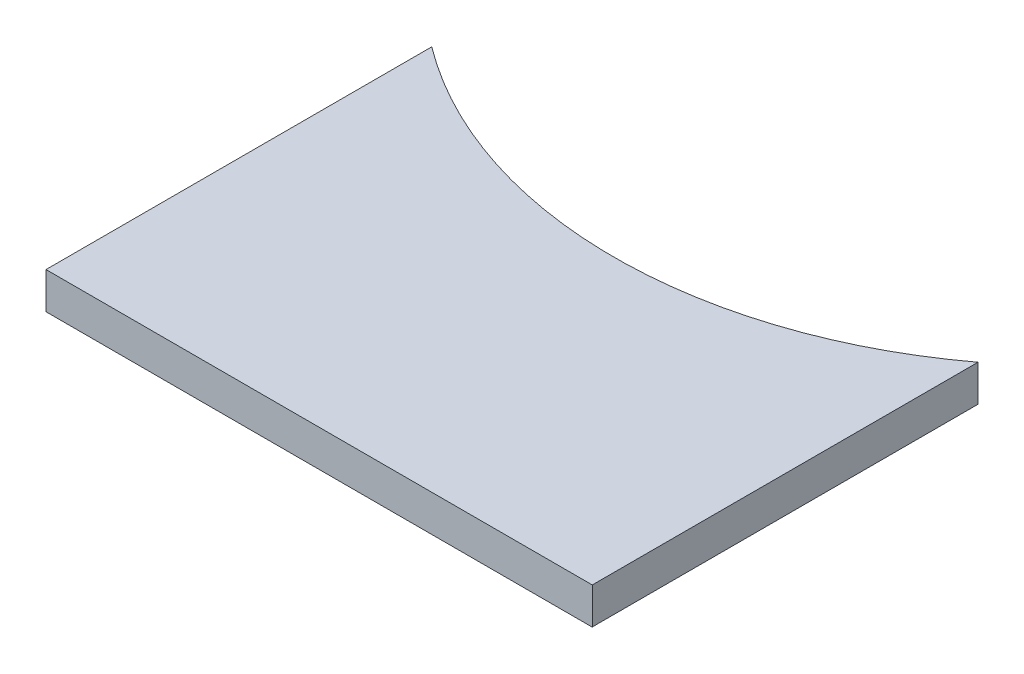
ISO-10303-21;
HEADER;
FILE_DESCRIPTION(('STEP AP214'),'2;1');
FILE_NAME('part.step','',(''),(''),'','','');
FILE_SCHEMA(('AUTOMOTIVE_DESIGN { 1 0 10303 214 1 1 1 1 }'));
ENDSEC;
DATA;
#1=APPLICATION_CONTEXT('core data for automotive mechanical design processes');
#2=APPLICATION_PROTOCOL_DEFINITION('international standard','automotive_design',2000,#1);
#3=PRODUCT_CONTEXT('',#1,'mechanical');
#4=PRODUCT('Part','Part','',(#3));
#5=PRODUCT_RELATED_PRODUCT_CATEGORY('part','',(#4));
#6=PRODUCT_DEFINITION_FORMATION('','',#4);
#7=PRODUCT_DEFINITION_CONTEXT('part definition',#1,'design');
#8=PRODUCT_DEFINITION('design','',#6,#7);
#9=PRODUCT_DEFINITION_SHAPE('','',#8);
#10=(LENGTH_UNIT() NAMED_UNIT(*) SI_UNIT(.MILLI.,.METRE.));
#11=(NAMED_UNIT(*) PLANE_ANGLE_UNIT() SI_UNIT($,.RADIAN.));
#12=(NAMED_UNIT(*) SI_UNIT($,.STERADIAN.) SOLID_ANGLE_UNIT());
#13=UNCERTAINTY_MEASURE_WITH_UNIT(LENGTH_MEASURE(1.E-05),#10,'distance_accuracy_value','');
#14=(GEOMETRIC_REPRESENTATION_CONTEXT(3) GLOBAL_UNCERTAINTY_ASSIGNED_CONTEXT((#13)) GLOBAL_UNIT_ASSIGNED_CONTEXT((#10,
#11,#12)) REPRESENTATION_CONTEXT('',''));
#15=CARTESIAN_POINT('',(0.,0.,0.));
#16=DIRECTION('',(0.,0.,1.));
#17=DIRECTION('',(1.,0.,0.));
#18=AXIS2_PLACEMENT_3D('',#15,#16,#17);
#19=CARTESIAN_POINT('',(0.,2.,0.));
#20=DIRECTION('',(0.,1.,0.));
#21=DIRECTION('',(0.,0.,1.));
#22=AXIS2_PLACEMENT_3D('',#19,#20,#21);
#23=PLANE('',#22);
#24=DIRECTION('',(-1.,0.,0.));
#25=VECTOR('',#24,1.);
#26=CARTESIAN_POINT('',(-17.7831215086461,2.,8.68357102907566));
#27=LINE('',#26,#25);
#28=CARTESIAN_POINT('',(15.,2.,8.68357102907566));
#29=VERTEX_POINT('',#28);
#30=CARTESIAN_POINT('',(-15.,2.,8.68357102907566));
#31=VERTEX_POINT('',#30);
#32=EDGE_CURVE('E80',#29,#31,#27,.T.);
#33=ORIENTED_EDGE('',*,*,#32,.F.);
#34=DIRECTION('',(0.,0.,-1.));
#35=VECTOR('',#34,1.);
#36=CARTESIAN_POINT('',(15.,2.,-12.5));
#37=LINE('',#36,#35);
#38=CARTESIAN_POINT('',(15.,2.,-12.5));
#39=VERTEX_POINT('',#38);
#40=EDGE_CURVE('E89',#29,#39,#37,.T.);
#41=ORIENTED_EDGE('',*,*,#40,.T.);
#42=CARTESIAN_POINT('',(0.,2.,-32.5));
#43=DIRECTION('',(0.,1.,0.));
#44=DIRECTION('',(0.,0.,1.));
#45=AXIS2_PLACEMENT_3D('',#42,#43,#44);
#46=CIRCLE('',#45,25.);
#47=CARTESIAN_POINT('',(-15.,2.,-12.5));
#48=VERTEX_POINT('',#47);
#49=EDGE_CURVE('E106',#48,#39,#46,.T.);
#50=ORIENTED_EDGE('',*,*,#49,.F.);
#51=DIRECTION('',(0.,0.,1.));
#52=VECTOR('',#51,1.);
#53=CARTESIAN_POINT('',(-15.,2.,-12.5));
#54=LINE('',#53,#52);
#55=EDGE_CURVE('E92',#48,#31,#54,.T.);
#56=ORIENTED_EDGE('',*,*,#55,.T.);
#57=EDGE_LOOP('',(#33,#41,#50,#56));
#58=FACE_BOUND('',#57,.T.);
#59=ADVANCED_FACE('F33',(#58),#23,.T.);
#60=CARTESIAN_POINT('',(0.,0.,0.));
#61=DIRECTION('',(0.,1.,0.));
#62=DIRECTION('',(0.,0.,1.));
#63=AXIS2_PLACEMENT_3D('',#60,#61,#62);
#64=PLANE('',#63);
#65=DIRECTION('',(0.,0.,-1.));
#66=VECTOR('',#65,1.);
#67=CARTESIAN_POINT('',(15.,0.,-12.5));
#68=LINE('',#67,#66);
#69=CARTESIAN_POINT('',(15.,0.,8.49999999999999));
#70=VERTEX_POINT('',#69);
#71=CARTESIAN_POINT('',(15.,0.,-12.5));
#72=VERTEX_POINT('',#71);
#73=EDGE_CURVE('E103',#70,#72,#68,.T.);
#74=ORIENTED_EDGE('',*,*,#73,.F.);
#75=DIRECTION('',(-1.,0.,0.));
#76=VECTOR('',#75,1.);
#77=CARTESIAN_POINT('',(0.,0.,8.5));
#78=LINE('',#77,#76);
#79=CARTESIAN_POINT('',(-15.,0.,8.49999999999999));
#80=VERTEX_POINT('',#79);
#81=EDGE_CURVE('E113',#70,#80,#78,.T.);
#82=ORIENTED_EDGE('',*,*,#81,.T.);
#83=DIRECTION('',(0.,0.,1.));
#84=VECTOR('',#83,1.);
#85=CARTESIAN_POINT('',(-15.,0.,-12.5));
#86=LINE('',#85,#84);
#87=CARTESIAN_POINT('',(-15.,0.,-12.5));
#88=VERTEX_POINT('',#87);
#89=EDGE_CURVE('E98',#88,#80,#86,.T.);
#90=ORIENTED_EDGE('',*,*,#89,.F.);
#91=CARTESIAN_POINT('',(0.,0.,-32.5));
#92=DIRECTION('',(0.,1.,0.));
#93=DIRECTION('',(0.,0.,1.));
#94=AXIS2_PLACEMENT_3D('',#91,#92,#93);
#95=CIRCLE('',#94,25.);
#96=EDGE_CURVE('E121',#88,#72,#95,.T.);
#97=ORIENTED_EDGE('',*,*,#96,.T.);
#98=EDGE_LOOP('',(#74,#82,#90,#97));
#99=FACE_BOUND('',#98,.T.);
#100=ADVANCED_FACE('F120',(#99),#64,.F.);
#101=CARTESIAN_POINT('',(15.,2.,-12.5));
#102=DIRECTION('',(-1.,0.,0.));
#103=DIRECTION('',(0.,0.,1.));
#104=AXIS2_PLACEMENT_3D('',#101,#102,#103);
#105=PLANE('',#104);
#106=ORIENTED_EDGE('',*,*,#40,.F.);
#107=DIRECTION('',(0.,1.,0.));
#108=VECTOR('',#107,1.);
#109=CARTESIAN_POINT('',(15.,-12.501,8.68357102907566));
#110=LINE('',#109,#108);
#111=CARTESIAN_POINT('',(15.,-0.00844239920505876,8.68357102907565));
#112=VERTEX_POINT('',#111);
#113=EDGE_CURVE('E77',#112,#29,#110,.T.);
#114=ORIENTED_EDGE('',*,*,#113,.F.);
#115=CARTESIAN_POINT('',(15.,-2.,8.5));
#116=DIRECTION('',(-1.,0.,0.));
#117=DIRECTION('',(0.,0.,1.));
#118=AXIS2_PLACEMENT_3D('',#115,#116,#117);
#119=CIRCLE('',#118,2.);
#120=EDGE_CURVE('E11',#112,#70,#119,.T.);
#121=ORIENTED_EDGE('',*,*,#120,.T.);
#122=ORIENTED_EDGE('',*,*,#73,.T.);
#123=DIRECTION('',(0.,-1.,0.));
#124=VECTOR('',#123,1.);
#125=CARTESIAN_POINT('',(15.,2.,-12.5));
#126=LINE('',#125,#124);
#127=EDGE_CURVE('E97',#39,#72,#126,.T.);
#128=ORIENTED_EDGE('',*,*,#127,.F.);
#129=EDGE_LOOP('',(#106,#114,#121,#122,#128));
#130=FACE_BOUND('',#129,.T.);
#131=ADVANCED_FACE('F95',(#130),#105,.F.);
#132=CARTESIAN_POINT('',(-15.,2.,-12.5));
#133=DIRECTION('',(1.,0.,0.));
#134=DIRECTION('',(0.,0.,-1.));
#135=AXIS2_PLACEMENT_3D('',#132,#133,#134);
#136=PLANE('',#135);
#137=CARTESIAN_POINT('',(-15.,-2.,8.5));
#138=DIRECTION('',(1.,0.,0.));
#139=DIRECTION('',(0.,0.,-1.));
#140=AXIS2_PLACEMENT_3D('',#137,#138,#139);
#141=CIRCLE('',#140,2.);
#142=CARTESIAN_POINT('',(-15.,-0.00844239920505833,8.68357102907566));
#143=VERTEX_POINT('',#142);
#144=EDGE_CURVE('E41',#80,#143,#141,.T.);
#145=ORIENTED_EDGE('',*,*,#144,.T.);
#146=DIRECTION('',(0.,-1.,0.));
#147=VECTOR('',#146,1.);
#148=CARTESIAN_POINT('',(-15.,-12.501,8.68357102907566));
#149=LINE('',#148,#147);
#150=EDGE_CURVE('E48',#31,#143,#149,.T.);
#151=ORIENTED_EDGE('',*,*,#150,.F.);
#152=ORIENTED_EDGE('',*,*,#55,.F.);
#153=DIRECTION('',(0.,-1.,0.));
#154=VECTOR('',#153,1.);
#155=CARTESIAN_POINT('',(-15.,2.,-12.5));
#156=LINE('',#155,#154);
#157=EDGE_CURVE('E100',#48,#88,#156,.T.);
#158=ORIENTED_EDGE('',*,*,#157,.T.);
#159=ORIENTED_EDGE('',*,*,#89,.T.);
#160=EDGE_LOOP('',(#145,#151,#152,#158,#159));
#161=FACE_BOUND('',#160,.T.);
#162=ADVANCED_FACE('F115',(#161),#136,.F.);
#163=CARTESIAN_POINT('',(0.,2.001,-32.5));
#164=DIRECTION('',(0.,-1.,0.));
#165=DIRECTION('',(0.,0.,-1.));
#166=AXIS2_PLACEMENT_3D('',#163,#164,#165);
#167=CYLINDRICAL_SURFACE('',#166,25.);
#168=ORIENTED_EDGE('',*,*,#96,.F.);
#169=ORIENTED_EDGE('',*,*,#157,.F.);
#170=ORIENTED_EDGE('',*,*,#49,.T.);
#171=ORIENTED_EDGE('',*,*,#127,.T.);
#172=EDGE_LOOP('',(#168,#169,#170,#171));
#173=FACE_BOUND('',#172,.T.);
#174=ADVANCED_FACE('F123',(#173),#167,.F.);
#175=CARTESIAN_POINT('',(0.,-2.,8.5));
#176=DIRECTION('',(-1.,0.,0.));
#177=DIRECTION('',(0.,0.,1.));
#178=AXIS2_PLACEMENT_3D('',#175,#176,#177);
#179=CYLINDRICAL_SURFACE('',#178,2.);
#180=ORIENTED_EDGE('',*,*,#120,.F.);
#181=DIRECTION('',(-1.,0.,0.));
#182=VECTOR('',#181,1.);
#183=CARTESIAN_POINT('',(0.,-0.00844239920505876,8.68357102907566));
#184=LINE('',#183,#182);
#185=EDGE_CURVE('E81',#143,#112,#184,.F.);
#186=ORIENTED_EDGE('',*,*,#185,.F.);
#187=ORIENTED_EDGE('',*,*,#144,.F.);
#188=ORIENTED_EDGE('',*,*,#81,.F.);
#189=EDGE_LOOP('',(#180,#186,#187,#188));
#190=FACE_BOUND('',#189,.T.);
#191=ADVANCED_FACE('F35',(#190),#179,.F.);
#192=CARTESIAN_POINT('',(-17.7831215086461,-12.501,8.68357102907566));
#193=DIRECTION('',(0.,0.,-1.));
#194=DIRECTION('',(-1.,0.,0.));
#195=AXIS2_PLACEMENT_3D('',#192,#193,#194);
#196=PLANE('',#195);
#197=ORIENTED_EDGE('',*,*,#113,.T.);
#198=ORIENTED_EDGE('',*,*,#32,.T.);
#199=ORIENTED_EDGE('',*,*,#150,.T.);
#200=ORIENTED_EDGE('',*,*,#185,.T.);
#201=EDGE_LOOP('',(#197,#198,#199,#200));
#202=FACE_BOUND('',#201,.T.);
#203=ADVANCED_FACE('F79',(#202),#196,.F.);
#204=CLOSED_SHELL('',(#59,#100,#131,#162,#174,#191,#203));
#205=MANIFOLD_SOLID_BREP('B2',#204);
#206=ADVANCED_BREP_SHAPE_REPRESENTATION('',(#18,#205),#14);
#207=SHAPE_DEFINITION_REPRESENTATION(#9,#206);
ENDSEC;
END-ISO-10303-21;
